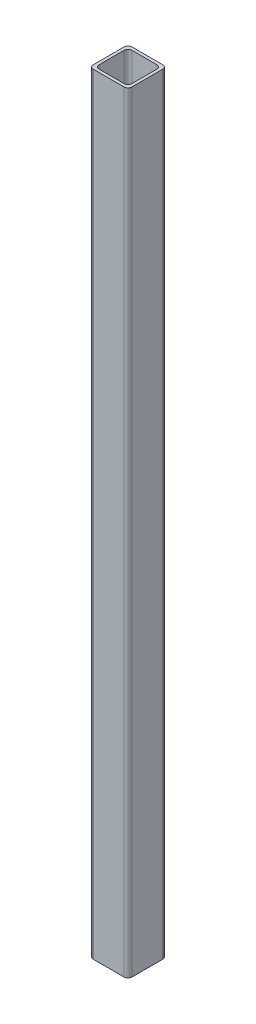
ISO-10303-21;
HEADER;
FILE_DESCRIPTION(('STEP AP214'),'2;1');
FILE_NAME('part.step','',(''),(''),'','','');
FILE_SCHEMA(('AUTOMOTIVE_DESIGN { 1 0 10303 214 1 1 1 1 }'));
ENDSEC;
DATA;
#1=APPLICATION_CONTEXT('core data for automotive mechanical design processes');
#2=APPLICATION_PROTOCOL_DEFINITION('international standard','automotive_design',2000,#1);
#3=PRODUCT_CONTEXT('',#1,'mechanical');
#4=PRODUCT('Part','Part','',(#3));
#5=PRODUCT_RELATED_PRODUCT_CATEGORY('part','',(#4));
#6=PRODUCT_DEFINITION_FORMATION('','',#4);
#7=PRODUCT_DEFINITION_CONTEXT('part definition',#1,'design');
#8=PRODUCT_DEFINITION('design','',#6,#7);
#9=PRODUCT_DEFINITION_SHAPE('','',#8);
#10=(LENGTH_UNIT() NAMED_UNIT(*) SI_UNIT(.MILLI.,.METRE.));
#11=(NAMED_UNIT(*) PLANE_ANGLE_UNIT() SI_UNIT($,.RADIAN.));
#12=(NAMED_UNIT(*) SI_UNIT($,.STERADIAN.) SOLID_ANGLE_UNIT());
#13=UNCERTAINTY_MEASURE_WITH_UNIT(LENGTH_MEASURE(1.E-05),#10,'distance_accuracy_value','');
#14=(GEOMETRIC_REPRESENTATION_CONTEXT(3) GLOBAL_UNCERTAINTY_ASSIGNED_CONTEXT((#13)) GLOBAL_UNIT_ASSIGNED_CONTEXT((#10,
#11,#12)) REPRESENTATION_CONTEXT('',''));
#15=CARTESIAN_POINT('',(0.,0.,0.));
#16=DIRECTION('',(0.,0.,1.));
#17=DIRECTION('',(1.,0.,0.));
#18=AXIS2_PLACEMENT_3D('',#15,#16,#17);
#19=CARTESIAN_POINT('',(-4.,200.,4.));
#20=DIRECTION('',(0.,-1.,0.));
#21=DIRECTION('',(0.,0.,-1.));
#22=AXIS2_PLACEMENT_3D('',#19,#20,#21);
#23=PLANE('',#22);
#24=CARTESIAN_POINT('',(-4.,200.,4.));
#25=DIRECTION('',(0.,1.,0.));
#26=DIRECTION('',(0.,0.,-1.));
#27=AXIS2_PLACEMENT_3D('',#24,#25,#26);
#28=CIRCLE('',#27,0.999999999999999);
#29=CARTESIAN_POINT('',(-5.,200.,4.));
#30=VERTEX_POINT('',#29);
#31=CARTESIAN_POINT('',(-4.,200.,5.));
#32=VERTEX_POINT('',#31);
#33=EDGE_CURVE('E213',#30,#32,#28,.T.);
#34=ORIENTED_EDGE('',*,*,#33,.T.);
#35=DIRECTION('',(1.,0.,0.));
#36=VECTOR('',#35,1.);
#37=CARTESIAN_POINT('',(-4.,200.,5.));
#38=LINE('',#37,#36);
#39=CARTESIAN_POINT('',(4.,200.,5.));
#40=VERTEX_POINT('',#39);
#41=EDGE_CURVE('E216',#32,#40,#38,.T.);
#42=ORIENTED_EDGE('',*,*,#41,.T.);
#43=CARTESIAN_POINT('',(4.,200.,4.));
#44=DIRECTION('',(0.,1.,0.));
#45=DIRECTION('',(0.,0.,1.));
#46=AXIS2_PLACEMENT_3D('',#43,#44,#45);
#47=CIRCLE('',#46,1.);
#48=CARTESIAN_POINT('',(5.,200.,4.));
#49=VERTEX_POINT('',#48);
#50=EDGE_CURVE('E219',#40,#49,#47,.T.);
#51=ORIENTED_EDGE('',*,*,#50,.T.);
#52=DIRECTION('',(0.,0.,-1.));
#53=VECTOR('',#52,1.);
#54=CARTESIAN_POINT('',(5.,200.,4.));
#55=LINE('',#54,#53);
#56=CARTESIAN_POINT('',(5.,200.,-4.));
#57=VERTEX_POINT('',#56);
#58=EDGE_CURVE('E221',#49,#57,#55,.T.);
#59=ORIENTED_EDGE('',*,*,#58,.T.);
#60=CARTESIAN_POINT('',(4.,200.,-4.));
#61=DIRECTION('',(0.,1.,0.));
#62=DIRECTION('',(0.,0.,-1.));
#63=AXIS2_PLACEMENT_3D('',#60,#61,#62);
#64=CIRCLE('',#63,1.);
#65=CARTESIAN_POINT('',(4.,200.,-5.));
#66=VERTEX_POINT('',#65);
#67=EDGE_CURVE('E223',#57,#66,#64,.T.);
#68=ORIENTED_EDGE('',*,*,#67,.T.);
#69=DIRECTION('',(-1.,0.,0.));
#70=VECTOR('',#69,1.);
#71=CARTESIAN_POINT('',(-4.,200.,-5.));
#72=LINE('',#71,#70);
#73=CARTESIAN_POINT('',(-4.,200.,-5.));
#74=VERTEX_POINT('',#73);
#75=EDGE_CURVE('E225',#66,#74,#72,.T.);
#76=ORIENTED_EDGE('',*,*,#75,.T.);
#77=CARTESIAN_POINT('',(-4.,200.,-4.));
#78=DIRECTION('',(0.,1.,0.));
#79=DIRECTION('',(0.,0.,-1.));
#80=AXIS2_PLACEMENT_3D('',#77,#78,#79);
#81=CIRCLE('',#80,0.999999999999999);
#82=CARTESIAN_POINT('',(-5.,200.,-4.));
#83=VERTEX_POINT('',#82);
#84=EDGE_CURVE('E227',#74,#83,#81,.T.);
#85=ORIENTED_EDGE('',*,*,#84,.T.);
#86=DIRECTION('',(0.,0.,1.));
#87=VECTOR('',#86,1.);
#88=CARTESIAN_POINT('',(-5.,200.,4.));
#89=LINE('',#88,#87);
#90=EDGE_CURVE('E229',#83,#30,#89,.T.);
#91=ORIENTED_EDGE('',*,*,#90,.T.);
#92=EDGE_LOOP('',(#34,#42,#51,#59,#68,#76,#85,#91));
#93=FACE_BOUND('',#92,.T.);
#94=CARTESIAN_POINT('',(-3.25,200.,3.25));
#95=DIRECTION('',(0.,1.,0.));
#96=DIRECTION('',(0.,0.,-1.));
#97=AXIS2_PLACEMENT_3D('',#94,#95,#96);
#98=CIRCLE('',#97,1.);
#99=CARTESIAN_POINT('',(-4.25,200.,3.25));
#100=VERTEX_POINT('',#99);
#101=CARTESIAN_POINT('',(-3.25,200.,4.25));
#102=VERTEX_POINT('',#101);
#103=EDGE_CURVE('E148',#100,#102,#98,.T.);
#104=ORIENTED_EDGE('',*,*,#103,.F.);
#105=DIRECTION('',(0.,0.,1.));
#106=VECTOR('',#105,1.);
#107=CARTESIAN_POINT('',(-4.25,200.,3.25));
#108=LINE('',#107,#106);
#109=CARTESIAN_POINT('',(-4.25,200.,-3.25));
#110=VERTEX_POINT('',#109);
#111=EDGE_CURVE('E181',#110,#100,#108,.T.);
#112=ORIENTED_EDGE('',*,*,#111,.F.);
#113=CARTESIAN_POINT('',(-3.25,200.,-3.25));
#114=DIRECTION('',(0.,1.,0.));
#115=DIRECTION('',(0.,0.,-1.));
#116=AXIS2_PLACEMENT_3D('',#113,#114,#115);
#117=CIRCLE('',#116,1.);
#118=CARTESIAN_POINT('',(-3.25,200.,-4.25));
#119=VERTEX_POINT('',#118);
#120=EDGE_CURVE('E179',#119,#110,#117,.T.);
#121=ORIENTED_EDGE('',*,*,#120,.F.);
#122=DIRECTION('',(-1.,0.,0.));
#123=VECTOR('',#122,1.);
#124=CARTESIAN_POINT('',(-3.25,200.,-4.25));
#125=LINE('',#124,#123);
#126=CARTESIAN_POINT('',(3.25,200.,-4.25));
#127=VERTEX_POINT('',#126);
#128=EDGE_CURVE('E177',#127,#119,#125,.T.);
#129=ORIENTED_EDGE('',*,*,#128,.F.);
#130=CARTESIAN_POINT('',(3.25,200.,-3.25));
#131=DIRECTION('',(0.,1.,0.));
#132=DIRECTION('',(0.,0.,-1.));
#133=AXIS2_PLACEMENT_3D('',#130,#131,#132);
#134=CIRCLE('',#133,1.);
#135=CARTESIAN_POINT('',(4.25,200.,-3.25));
#136=VERTEX_POINT('',#135);
#137=EDGE_CURVE('E175',#136,#127,#134,.T.);
#138=ORIENTED_EDGE('',*,*,#137,.F.);
#139=DIRECTION('',(0.,0.,-1.));
#140=VECTOR('',#139,1.);
#141=CARTESIAN_POINT('',(4.25,200.,3.25));
#142=LINE('',#141,#140);
#143=CARTESIAN_POINT('',(4.25,200.,3.25));
#144=VERTEX_POINT('',#143);
#145=EDGE_CURVE('E171',#144,#136,#142,.T.);
#146=ORIENTED_EDGE('',*,*,#145,.F.);
#147=CARTESIAN_POINT('',(3.25,200.,3.25));
#148=DIRECTION('',(0.,1.,0.));
#149=DIRECTION('',(0.,0.,1.));
#150=AXIS2_PLACEMENT_3D('',#147,#148,#149);
#151=CIRCLE('',#150,1.);
#152=CARTESIAN_POINT('',(3.25,200.,4.25));
#153=VERTEX_POINT('',#152);
#154=EDGE_CURVE('E169',#153,#144,#151,.T.);
#155=ORIENTED_EDGE('',*,*,#154,.F.);
#156=DIRECTION('',(1.,0.,0.));
#157=VECTOR('',#156,1.);
#158=CARTESIAN_POINT('',(-3.25,200.,4.25));
#159=LINE('',#158,#157);
#160=EDGE_CURVE('E156',#102,#153,#159,.T.);
#161=ORIENTED_EDGE('',*,*,#160,.F.);
#162=EDGE_LOOP('',(#104,#112,#121,#129,#138,#146,#155,#161));
#163=FACE_BOUND('',#162,.T.);
#164=ADVANCED_FACE('F35',(#93,#163),#23,.F.);
#165=CARTESIAN_POINT('',(-4.,0.,4.));
#166=DIRECTION('',(0.,-1.,0.));
#167=DIRECTION('',(0.,0.,-1.));
#168=AXIS2_PLACEMENT_3D('',#165,#166,#167);
#169=PLANE('',#168);
#170=CARTESIAN_POINT('',(-4.,0.,4.));
#171=DIRECTION('',(0.,1.,0.));
#172=DIRECTION('',(0.,0.,-1.));
#173=AXIS2_PLACEMENT_3D('',#170,#171,#172);
#174=CIRCLE('',#173,0.999999999999999);
#175=CARTESIAN_POINT('',(-5.,0.,4.));
#176=VERTEX_POINT('',#175);
#177=CARTESIAN_POINT('',(-4.,0.,5.));
#178=VERTEX_POINT('',#177);
#179=EDGE_CURVE('E164',#176,#178,#174,.T.);
#180=ORIENTED_EDGE('',*,*,#179,.F.);
#181=DIRECTION('',(0.,0.,1.));
#182=VECTOR('',#181,1.);
#183=CARTESIAN_POINT('',(-5.,0.,4.));
#184=LINE('',#183,#182);
#185=CARTESIAN_POINT('',(-5.,0.,-4.));
#186=VERTEX_POINT('',#185);
#187=EDGE_CURVE('E217',#186,#176,#184,.T.);
#188=ORIENTED_EDGE('',*,*,#187,.F.);
#189=CARTESIAN_POINT('',(-4.,0.,-4.));
#190=DIRECTION('',(0.,1.,0.));
#191=DIRECTION('',(0.,0.,-1.));
#192=AXIS2_PLACEMENT_3D('',#189,#190,#191);
#193=CIRCLE('',#192,0.999999999999999);
#194=CARTESIAN_POINT('',(-4.,0.,-5.));
#195=VERTEX_POINT('',#194);
#196=EDGE_CURVE('E244',#195,#186,#193,.T.);
#197=ORIENTED_EDGE('',*,*,#196,.F.);
#198=DIRECTION('',(-1.,0.,0.));
#199=VECTOR('',#198,1.);
#200=CARTESIAN_POINT('',(-4.,0.,-5.));
#201=LINE('',#200,#199);
#202=CARTESIAN_POINT('',(4.,0.,-5.));
#203=VERTEX_POINT('',#202);
#204=EDGE_CURVE('E242',#203,#195,#201,.T.);
#205=ORIENTED_EDGE('',*,*,#204,.F.);
#206=CARTESIAN_POINT('',(4.,0.,-4.));
#207=DIRECTION('',(0.,1.,0.));
#208=DIRECTION('',(0.,0.,-1.));
#209=AXIS2_PLACEMENT_3D('',#206,#207,#208);
#210=CIRCLE('',#209,1.);
#211=CARTESIAN_POINT('',(5.,0.,-4.));
#212=VERTEX_POINT('',#211);
#213=EDGE_CURVE('E240',#212,#203,#210,.T.);
#214=ORIENTED_EDGE('',*,*,#213,.F.);
#215=DIRECTION('',(0.,0.,-1.));
#216=VECTOR('',#215,1.);
#217=CARTESIAN_POINT('',(5.,0.,4.));
#218=LINE('',#217,#216);
#219=CARTESIAN_POINT('',(5.,0.,4.));
#220=VERTEX_POINT('',#219);
#221=EDGE_CURVE('E238',#220,#212,#218,.T.);
#222=ORIENTED_EDGE('',*,*,#221,.F.);
#223=CARTESIAN_POINT('',(4.,0.,4.));
#224=DIRECTION('',(0.,1.,0.));
#225=DIRECTION('',(0.,0.,1.));
#226=AXIS2_PLACEMENT_3D('',#223,#224,#225);
#227=CIRCLE('',#226,1.);
#228=CARTESIAN_POINT('',(4.,0.,5.));
#229=VERTEX_POINT('',#228);
#230=EDGE_CURVE('E236',#229,#220,#227,.T.);
#231=ORIENTED_EDGE('',*,*,#230,.F.);
#232=DIRECTION('',(1.,0.,0.));
#233=VECTOR('',#232,1.);
#234=CARTESIAN_POINT('',(-4.,0.,5.));
#235=LINE('',#234,#233);
#236=EDGE_CURVE('E234',#178,#229,#235,.T.);
#237=ORIENTED_EDGE('',*,*,#236,.F.);
#238=EDGE_LOOP('',(#180,#188,#197,#205,#214,#222,#231,#237));
#239=FACE_BOUND('',#238,.T.);
#240=DIRECTION('',(0.,0.,1.));
#241=VECTOR('',#240,1.);
#242=CARTESIAN_POINT('',(-4.25,0.,3.25));
#243=LINE('',#242,#241);
#244=CARTESIAN_POINT('',(-4.25,0.,-3.25));
#245=VERTEX_POINT('',#244);
#246=CARTESIAN_POINT('',(-4.25,0.,3.25));
#247=VERTEX_POINT('',#246);
#248=EDGE_CURVE('E157',#245,#247,#243,.T.);
#249=ORIENTED_EDGE('',*,*,#248,.T.);
#250=CARTESIAN_POINT('',(-3.25,0.,3.25));
#251=DIRECTION('',(0.,1.,0.));
#252=DIRECTION('',(0.,0.,-1.));
#253=AXIS2_PLACEMENT_3D('',#250,#251,#252);
#254=CIRCLE('',#253,1.);
#255=CARTESIAN_POINT('',(-3.25,0.,4.25));
#256=VERTEX_POINT('',#255);
#257=EDGE_CURVE('E58',#247,#256,#254,.T.);
#258=ORIENTED_EDGE('',*,*,#257,.T.);
#259=DIRECTION('',(1.,0.,0.));
#260=VECTOR('',#259,1.);
#261=CARTESIAN_POINT('',(-3.25,0.,4.25));
#262=LINE('',#261,#260);
#263=CARTESIAN_POINT('',(3.25,0.,4.25));
#264=VERTEX_POINT('',#263);
#265=EDGE_CURVE('E163',#256,#264,#262,.T.);
#266=ORIENTED_EDGE('',*,*,#265,.T.);
#267=CARTESIAN_POINT('',(3.25,0.,3.25));
#268=DIRECTION('',(0.,1.,0.));
#269=DIRECTION('',(0.,0.,1.));
#270=AXIS2_PLACEMENT_3D('',#267,#268,#269);
#271=CIRCLE('',#270,1.);
#272=CARTESIAN_POINT('',(4.25,0.,3.25));
#273=VERTEX_POINT('',#272);
#274=EDGE_CURVE('E185',#264,#273,#271,.T.);
#275=ORIENTED_EDGE('',*,*,#274,.T.);
#276=DIRECTION('',(0.,0.,-1.));
#277=VECTOR('',#276,1.);
#278=CARTESIAN_POINT('',(4.25,0.,3.25));
#279=LINE('',#278,#277);
#280=CARTESIAN_POINT('',(4.25,0.,-3.25));
#281=VERTEX_POINT('',#280);
#282=EDGE_CURVE('E188',#273,#281,#279,.T.);
#283=ORIENTED_EDGE('',*,*,#282,.T.);
#284=CARTESIAN_POINT('',(3.25,0.,-3.25));
#285=DIRECTION('',(0.,1.,0.));
#286=DIRECTION('',(0.,0.,-1.));
#287=AXIS2_PLACEMENT_3D('',#284,#285,#286);
#288=CIRCLE('',#287,1.);
#289=CARTESIAN_POINT('',(3.25,0.,-4.25));
#290=VERTEX_POINT('',#289);
#291=EDGE_CURVE('E191',#281,#290,#288,.T.);
#292=ORIENTED_EDGE('',*,*,#291,.T.);
#293=DIRECTION('',(-1.,0.,0.));
#294=VECTOR('',#293,1.);
#295=CARTESIAN_POINT('',(-3.25,0.,-4.25));
#296=LINE('',#295,#294);
#297=CARTESIAN_POINT('',(-3.25,0.,-4.25));
#298=VERTEX_POINT('',#297);
#299=EDGE_CURVE('E194',#290,#298,#296,.T.);
#300=ORIENTED_EDGE('',*,*,#299,.T.);
#301=CARTESIAN_POINT('',(-3.25,0.,-3.25));
#302=DIRECTION('',(0.,1.,0.));
#303=DIRECTION('',(0.,0.,-1.));
#304=AXIS2_PLACEMENT_3D('',#301,#302,#303);
#305=CIRCLE('',#304,1.);
#306=EDGE_CURVE('E197',#298,#245,#305,.T.);
#307=ORIENTED_EDGE('',*,*,#306,.T.);
#308=EDGE_LOOP('',(#249,#258,#266,#275,#283,#292,#300,#307));
#309=FACE_BOUND('',#308,.T.);
#310=ADVANCED_FACE('F274',(#239,#309),#169,.T.);
#311=CARTESIAN_POINT('',(-4.,200.,4.));
#312=DIRECTION('',(0.,-1.,0.));
#313=DIRECTION('',(0.,0.,-1.));
#314=AXIS2_PLACEMENT_3D('',#311,#312,#313);
#315=CYLINDRICAL_SURFACE('',#314,0.999999999999999);
#316=ORIENTED_EDGE('',*,*,#179,.T.);
#317=DIRECTION('',(0.,-1.,0.));
#318=VECTOR('',#317,1.);
#319=CARTESIAN_POINT('',(-4.,200.,5.));
#320=LINE('',#319,#318);
#321=EDGE_CURVE('E11',#32,#178,#320,.T.);
#322=ORIENTED_EDGE('',*,*,#321,.F.);
#323=ORIENTED_EDGE('',*,*,#33,.F.);
#324=DIRECTION('',(0.,-1.,0.));
#325=VECTOR('',#324,1.);
#326=CARTESIAN_POINT('',(-5.,200.,4.));
#327=LINE('',#326,#325);
#328=EDGE_CURVE('E231',#30,#176,#327,.T.);
#329=ORIENTED_EDGE('',*,*,#328,.T.);
#330=EDGE_LOOP('',(#316,#322,#323,#329));
#331=FACE_BOUND('',#330,.T.);
#332=ADVANCED_FACE('F37',(#331),#315,.T.);
#333=CARTESIAN_POINT('',(-4.,200.,5.));
#334=DIRECTION('',(0.,0.,-1.));
#335=DIRECTION('',(-1.,0.,0.));
#336=AXIS2_PLACEMENT_3D('',#333,#334,#335);
#337=PLANE('',#336);
#338=ORIENTED_EDGE('',*,*,#236,.T.);
#339=DIRECTION('',(0.,-1.,0.));
#340=VECTOR('',#339,1.);
#341=CARTESIAN_POINT('',(4.,200.,5.));
#342=LINE('',#341,#340);
#343=EDGE_CURVE('E43',#40,#229,#342,.T.);
#344=ORIENTED_EDGE('',*,*,#343,.F.);
#345=ORIENTED_EDGE('',*,*,#41,.F.);
#346=ORIENTED_EDGE('',*,*,#321,.T.);
#347=EDGE_LOOP('',(#338,#344,#345,#346));
#348=FACE_BOUND('',#347,.T.);
#349=ADVANCED_FACE('F291',(#348),#337,.F.);
#350=CARTESIAN_POINT('',(4.,200.,4.));
#351=DIRECTION('',(0.,-1.,0.));
#352=DIRECTION('',(0.,0.,-1.));
#353=AXIS2_PLACEMENT_3D('',#350,#351,#352);
#354=CYLINDRICAL_SURFACE('',#353,1.);
#355=ORIENTED_EDGE('',*,*,#230,.T.);
#356=DIRECTION('',(0.,-1.,0.));
#357=VECTOR('',#356,1.);
#358=CARTESIAN_POINT('',(5.,200.,4.));
#359=LINE('',#358,#357);
#360=EDGE_CURVE('E261',#49,#220,#359,.T.);
#361=ORIENTED_EDGE('',*,*,#360,.F.);
#362=ORIENTED_EDGE('',*,*,#50,.F.);
#363=ORIENTED_EDGE('',*,*,#343,.T.);
#364=EDGE_LOOP('',(#355,#361,#362,#363));
#365=FACE_BOUND('',#364,.T.);
#366=ADVANCED_FACE('F268',(#365),#354,.T.);
#367=CARTESIAN_POINT('',(5.,200.,4.));
#368=DIRECTION('',(-1.,0.,0.));
#369=DIRECTION('',(0.,0.,1.));
#370=AXIS2_PLACEMENT_3D('',#367,#368,#369);
#371=PLANE('',#370);
#372=ORIENTED_EDGE('',*,*,#221,.T.);
#373=DIRECTION('',(0.,-1.,0.));
#374=VECTOR('',#373,1.);
#375=CARTESIAN_POINT('',(5.,200.,-4.));
#376=LINE('',#375,#374);
#377=EDGE_CURVE('E258',#57,#212,#376,.T.);
#378=ORIENTED_EDGE('',*,*,#377,.F.);
#379=ORIENTED_EDGE('',*,*,#58,.F.);
#380=ORIENTED_EDGE('',*,*,#360,.T.);
#381=EDGE_LOOP('',(#372,#378,#379,#380));
#382=FACE_BOUND('',#381,.T.);
#383=ADVANCED_FACE('F280',(#382),#371,.F.);
#384=CARTESIAN_POINT('',(4.,200.,-4.));
#385=DIRECTION('',(0.,-1.,0.));
#386=DIRECTION('',(0.,0.,-1.));
#387=AXIS2_PLACEMENT_3D('',#384,#385,#386);
#388=CYLINDRICAL_SURFACE('',#387,1.);
#389=ORIENTED_EDGE('',*,*,#213,.T.);
#390=DIRECTION('',(0.,-1.,0.));
#391=VECTOR('',#390,1.);
#392=CARTESIAN_POINT('',(4.,200.,-5.));
#393=LINE('',#392,#391);
#394=EDGE_CURVE('E255',#66,#203,#393,.T.);
#395=ORIENTED_EDGE('',*,*,#394,.F.);
#396=ORIENTED_EDGE('',*,*,#67,.F.);
#397=ORIENTED_EDGE('',*,*,#377,.T.);
#398=EDGE_LOOP('',(#389,#395,#396,#397));
#399=FACE_BOUND('',#398,.T.);
#400=ADVANCED_FACE('F284',(#399),#388,.T.);
#401=CARTESIAN_POINT('',(-4.,200.,-5.));
#402=DIRECTION('',(0.,0.,1.));
#403=DIRECTION('',(1.,0.,0.));
#404=AXIS2_PLACEMENT_3D('',#401,#402,#403);
#405=PLANE('',#404);
#406=ORIENTED_EDGE('',*,*,#204,.T.);
#407=DIRECTION('',(0.,-1.,0.));
#408=VECTOR('',#407,1.);
#409=CARTESIAN_POINT('',(-4.,200.,-5.));
#410=LINE('',#409,#408);
#411=EDGE_CURVE('E252',#74,#195,#410,.T.);
#412=ORIENTED_EDGE('',*,*,#411,.F.);
#413=ORIENTED_EDGE('',*,*,#75,.F.);
#414=ORIENTED_EDGE('',*,*,#394,.T.);
#415=EDGE_LOOP('',(#406,#412,#413,#414));
#416=FACE_BOUND('',#415,.T.);
#417=ADVANCED_FACE('F304',(#416),#405,.F.);
#418=CARTESIAN_POINT('',(-4.,200.,-4.));
#419=DIRECTION('',(0.,-1.,0.));
#420=DIRECTION('',(0.,0.,-1.));
#421=AXIS2_PLACEMENT_3D('',#418,#419,#420);
#422=CYLINDRICAL_SURFACE('',#421,0.999999999999999);
#423=ORIENTED_EDGE('',*,*,#196,.T.);
#424=DIRECTION('',(0.,-1.,0.));
#425=VECTOR('',#424,1.);
#426=CARTESIAN_POINT('',(-5.,200.,-4.));
#427=LINE('',#426,#425);
#428=EDGE_CURVE('E249',#83,#186,#427,.T.);
#429=ORIENTED_EDGE('',*,*,#428,.F.);
#430=ORIENTED_EDGE('',*,*,#84,.F.);
#431=ORIENTED_EDGE('',*,*,#411,.T.);
#432=EDGE_LOOP('',(#423,#429,#430,#431));
#433=FACE_BOUND('',#432,.T.);
#434=ADVANCED_FACE('F302',(#433),#422,.T.);
#435=CARTESIAN_POINT('',(-5.,200.,4.));
#436=DIRECTION('',(1.,0.,0.));
#437=DIRECTION('',(0.,0.,-1.));
#438=AXIS2_PLACEMENT_3D('',#435,#436,#437);
#439=PLANE('',#438);
#440=ORIENTED_EDGE('',*,*,#187,.T.);
#441=ORIENTED_EDGE('',*,*,#328,.F.);
#442=ORIENTED_EDGE('',*,*,#90,.F.);
#443=ORIENTED_EDGE('',*,*,#428,.T.);
#444=EDGE_LOOP('',(#440,#441,#442,#443));
#445=FACE_BOUND('',#444,.T.);
#446=ADVANCED_FACE('F297',(#445),#439,.F.);
#447=CARTESIAN_POINT('',(-3.25,200.,3.25));
#448=DIRECTION('',(0.,-1.,0.));
#449=DIRECTION('',(0.,0.,-1.));
#450=AXIS2_PLACEMENT_3D('',#447,#448,#449);
#451=CYLINDRICAL_SURFACE('',#450,1.);
#452=ORIENTED_EDGE('',*,*,#257,.F.);
#453=DIRECTION('',(0.,-1.,0.));
#454=VECTOR('',#453,1.);
#455=CARTESIAN_POINT('',(-4.25,200.,3.25));
#456=LINE('',#455,#454);
#457=EDGE_CURVE('E152',#100,#247,#456,.T.);
#458=ORIENTED_EDGE('',*,*,#457,.F.);
#459=ORIENTED_EDGE('',*,*,#103,.T.);
#460=DIRECTION('',(0.,-1.,0.));
#461=VECTOR('',#460,1.);
#462=CARTESIAN_POINT('',(-3.25,200.,4.25));
#463=LINE('',#462,#461);
#464=EDGE_CURVE('E151',#102,#256,#463,.T.);
#465=ORIENTED_EDGE('',*,*,#464,.T.);
#466=EDGE_LOOP('',(#452,#458,#459,#465));
#467=FACE_BOUND('',#466,.T.);
#468=ADVANCED_FACE('F150',(#467),#451,.F.);
#469=CARTESIAN_POINT('',(-3.25,200.,4.25));
#470=DIRECTION('',(0.,0.,-1.));
#471=DIRECTION('',(-1.,0.,0.));
#472=AXIS2_PLACEMENT_3D('',#469,#470,#471);
#473=PLANE('',#472);
#474=ORIENTED_EDGE('',*,*,#265,.F.);
#475=ORIENTED_EDGE('',*,*,#464,.F.);
#476=ORIENTED_EDGE('',*,*,#160,.T.);
#477=DIRECTION('',(0.,-1.,0.));
#478=VECTOR('',#477,1.);
#479=CARTESIAN_POINT('',(3.25,200.,4.25));
#480=LINE('',#479,#478);
#481=EDGE_CURVE('E165',#153,#264,#480,.T.);
#482=ORIENTED_EDGE('',*,*,#481,.T.);
#483=EDGE_LOOP('',(#474,#475,#476,#482));
#484=FACE_BOUND('',#483,.T.);
#485=ADVANCED_FACE('F160',(#484),#473,.T.);
#486=CARTESIAN_POINT('',(3.25,200.,3.25));
#487=DIRECTION('',(0.,-1.,0.));
#488=DIRECTION('',(0.,0.,-1.));
#489=AXIS2_PLACEMENT_3D('',#486,#487,#488);
#490=CYLINDRICAL_SURFACE('',#489,1.);
#491=ORIENTED_EDGE('',*,*,#274,.F.);
#492=ORIENTED_EDGE('',*,*,#481,.F.);
#493=ORIENTED_EDGE('',*,*,#154,.T.);
#494=DIRECTION('',(0.,-1.,0.));
#495=VECTOR('',#494,1.);
#496=CARTESIAN_POINT('',(4.25,200.,3.25));
#497=LINE('',#496,#495);
#498=EDGE_CURVE('E210',#144,#273,#497,.T.);
#499=ORIENTED_EDGE('',*,*,#498,.T.);
#500=EDGE_LOOP('',(#491,#492,#493,#499));
#501=FACE_BOUND('',#500,.T.);
#502=ADVANCED_FACE('F329',(#501),#490,.F.);
#503=CARTESIAN_POINT('',(4.25,200.,3.25));
#504=DIRECTION('',(-1.,0.,0.));
#505=DIRECTION('',(0.,0.,1.));
#506=AXIS2_PLACEMENT_3D('',#503,#504,#505);
#507=PLANE('',#506);
#508=ORIENTED_EDGE('',*,*,#282,.F.);
#509=ORIENTED_EDGE('',*,*,#498,.F.);
#510=ORIENTED_EDGE('',*,*,#145,.T.);
#511=DIRECTION('',(0.,-1.,0.));
#512=VECTOR('',#511,1.);
#513=CARTESIAN_POINT('',(4.25,200.,-3.25));
#514=LINE('',#513,#512);
#515=EDGE_CURVE('E208',#136,#281,#514,.T.);
#516=ORIENTED_EDGE('',*,*,#515,.T.);
#517=EDGE_LOOP('',(#508,#509,#510,#516));
#518=FACE_BOUND('',#517,.T.);
#519=ADVANCED_FACE('F333',(#518),#507,.T.);
#520=CARTESIAN_POINT('',(3.25,200.,-3.25));
#521=DIRECTION('',(0.,-1.,0.));
#522=DIRECTION('',(0.,0.,-1.));
#523=AXIS2_PLACEMENT_3D('',#520,#521,#522);
#524=CYLINDRICAL_SURFACE('',#523,1.);
#525=ORIENTED_EDGE('',*,*,#291,.F.);
#526=ORIENTED_EDGE('',*,*,#515,.F.);
#527=ORIENTED_EDGE('',*,*,#137,.T.);
#528=DIRECTION('',(0.,-1.,0.));
#529=VECTOR('',#528,1.);
#530=CARTESIAN_POINT('',(3.25,200.,-4.25));
#531=LINE('',#530,#529);
#532=EDGE_CURVE('E206',#127,#290,#531,.T.);
#533=ORIENTED_EDGE('',*,*,#532,.T.);
#534=EDGE_LOOP('',(#525,#526,#527,#533));
#535=FACE_BOUND('',#534,.T.);
#536=ADVANCED_FACE('F339',(#535),#524,.F.);
#537=CARTESIAN_POINT('',(-3.25,200.,-4.25));
#538=DIRECTION('',(0.,0.,1.));
#539=DIRECTION('',(1.,0.,0.));
#540=AXIS2_PLACEMENT_3D('',#537,#538,#539);
#541=PLANE('',#540);
#542=ORIENTED_EDGE('',*,*,#299,.F.);
#543=ORIENTED_EDGE('',*,*,#532,.F.);
#544=ORIENTED_EDGE('',*,*,#128,.T.);
#545=DIRECTION('',(0.,-1.,0.));
#546=VECTOR('',#545,1.);
#547=CARTESIAN_POINT('',(-3.25,200.,-4.25));
#548=LINE('',#547,#546);
#549=EDGE_CURVE('E204',#119,#298,#548,.T.);
#550=ORIENTED_EDGE('',*,*,#549,.T.);
#551=EDGE_LOOP('',(#542,#543,#544,#550));
#552=FACE_BOUND('',#551,.T.);
#553=ADVANCED_FACE('F343',(#552),#541,.T.);
#554=CARTESIAN_POINT('',(-3.25,200.,-3.25));
#555=DIRECTION('',(0.,-1.,0.));
#556=DIRECTION('',(0.,0.,-1.));
#557=AXIS2_PLACEMENT_3D('',#554,#555,#556);
#558=CYLINDRICAL_SURFACE('',#557,1.);
#559=ORIENTED_EDGE('',*,*,#306,.F.);
#560=ORIENTED_EDGE('',*,*,#549,.F.);
#561=ORIENTED_EDGE('',*,*,#120,.T.);
#562=DIRECTION('',(0.,-1.,0.));
#563=VECTOR('',#562,1.);
#564=CARTESIAN_POINT('',(-4.25,200.,-3.25));
#565=LINE('',#564,#563);
#566=EDGE_CURVE('E50',#110,#245,#565,.T.);
#567=ORIENTED_EDGE('',*,*,#566,.T.);
#568=EDGE_LOOP('',(#559,#560,#561,#567));
#569=FACE_BOUND('',#568,.T.);
#570=ADVANCED_FACE('F347',(#569),#558,.F.);
#571=CARTESIAN_POINT('',(-4.25,200.,3.25));
#572=DIRECTION('',(1.,0.,0.));
#573=DIRECTION('',(0.,0.,-1.));
#574=AXIS2_PLACEMENT_3D('',#571,#572,#573);
#575=PLANE('',#574);
#576=ORIENTED_EDGE('',*,*,#248,.F.);
#577=ORIENTED_EDGE('',*,*,#566,.F.);
#578=ORIENTED_EDGE('',*,*,#111,.T.);
#579=ORIENTED_EDGE('',*,*,#457,.T.);
#580=EDGE_LOOP('',(#576,#577,#578,#579));
#581=FACE_BOUND('',#580,.T.);
#582=ADVANCED_FACE('F351',(#581),#575,.T.);
#583=CLOSED_SHELL('',(#164,#310,#332,#349,#366,#383,#400,#417,#434,#446,#468,#485,#502,#519,
#536,#553,#570,#582));
#584=MANIFOLD_SOLID_BREP('B2',#583);
#585=ADVANCED_BREP_SHAPE_REPRESENTATION('',(#18,#584),#14);
#586=SHAPE_DEFINITION_REPRESENTATION(#9,#585);
ENDSEC;
END-ISO-10303-21;
